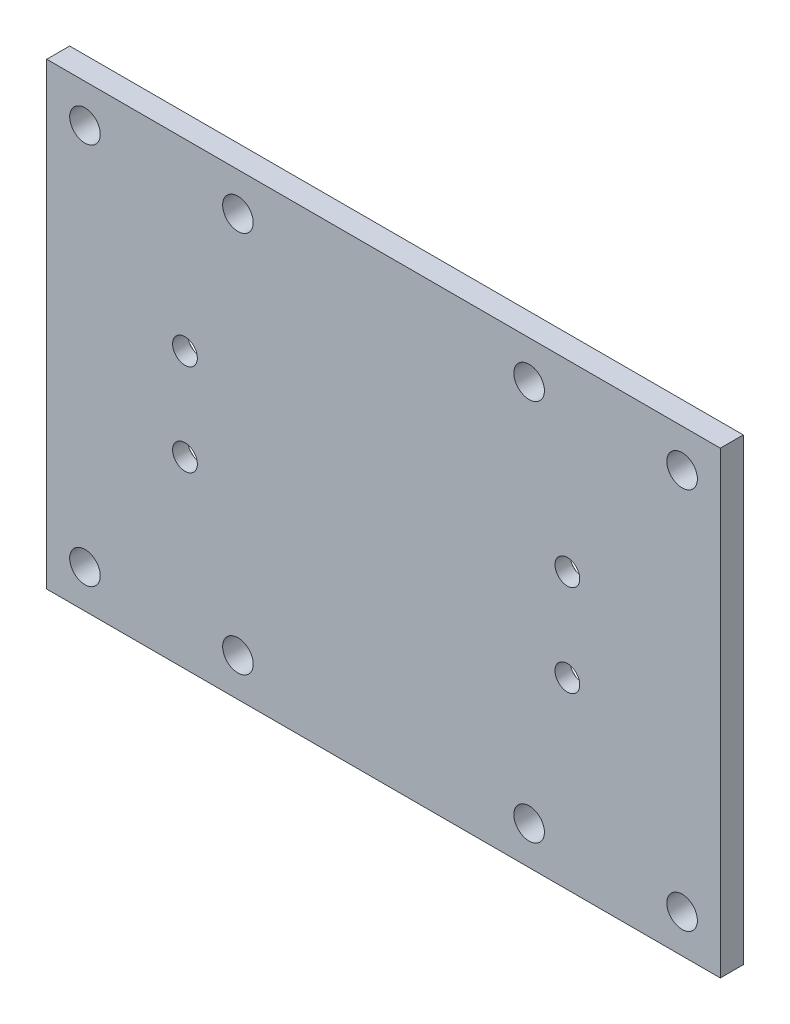
ISO-10303-21;
HEADER;
FILE_DESCRIPTION(('STEP AP214'),'2;1');
FILE_NAME('part.step','',(''),(''),'','','');
FILE_SCHEMA(('AUTOMOTIVE_DESIGN { 1 0 10303 214 1 1 1 1 }'));
ENDSEC;
DATA;
#1=APPLICATION_CONTEXT('core data for automotive mechanical design processes');
#2=APPLICATION_PROTOCOL_DEFINITION('international standard','automotive_design',2000,#1);
#3=PRODUCT_CONTEXT('',#1,'mechanical');
#4=PRODUCT('Part','Part','',(#3));
#5=PRODUCT_RELATED_PRODUCT_CATEGORY('part','',(#4));
#6=PRODUCT_DEFINITION_FORMATION('','',#4);
#7=PRODUCT_DEFINITION_CONTEXT('part definition',#1,'design');
#8=PRODUCT_DEFINITION('design','',#6,#7);
#9=PRODUCT_DEFINITION_SHAPE('','',#8);
#10=(LENGTH_UNIT() NAMED_UNIT(*) SI_UNIT(.MILLI.,.METRE.));
#11=(NAMED_UNIT(*) PLANE_ANGLE_UNIT() SI_UNIT($,.RADIAN.));
#12=(NAMED_UNIT(*) SI_UNIT($,.STERADIAN.) SOLID_ANGLE_UNIT());
#13=UNCERTAINTY_MEASURE_WITH_UNIT(LENGTH_MEASURE(1.E-05),#10,'distance_accuracy_value','');
#14=(GEOMETRIC_REPRESENTATION_CONTEXT(3) GLOBAL_UNCERTAINTY_ASSIGNED_CONTEXT((#13)) GLOBAL_UNIT_ASSIGNED_CONTEXT((#10,
#11,#12)) REPRESENTATION_CONTEXT('',''));
#15=CARTESIAN_POINT('',(0.,0.,0.));
#16=DIRECTION('',(0.,0.,1.));
#17=DIRECTION('',(1.,0.,0.));
#18=AXIS2_PLACEMENT_3D('',#15,#16,#17);
#19=CARTESIAN_POINT('',(-96.4046078557331,36.,3.));
#20=DIRECTION('',(0.,0.,-1.));
#21=DIRECTION('',(-1.,0.,0.));
#22=AXIS2_PLACEMENT_3D('',#19,#20,#21);
#23=CYLINDRICAL_SURFACE('',#22,1.62);
#24=CARTESIAN_POINT('',(-96.4046078557331,36.,3.));
#25=DIRECTION('',(0.,0.,-1.));
#26=DIRECTION('',(-1.,0.,0.));
#27=AXIS2_PLACEMENT_3D('',#24,#25,#26);
#28=CIRCLE('',#27,1.62);
#29=CARTESIAN_POINT('',(-98.0246078557331,36.,3.));
#30=VERTEX_POINT('',#29);
#31=EDGE_CURVE('E142',#30,#30,#28,.T.);
#32=ORIENTED_EDGE('',*,*,#31,.F.);
#33=EDGE_LOOP('',(#32));
#34=FACE_BOUND('',#33,.T.);
#35=CARTESIAN_POINT('',(-96.4046078557331,36.,1.));
#36=DIRECTION('',(0.,0.,-1.));
#37=DIRECTION('',(-1.,0.,0.));
#38=AXIS2_PLACEMENT_3D('',#35,#36,#37);
#39=CIRCLE('',#38,1.62);
#40=CARTESIAN_POINT('',(-98.0246078557331,36.,1.));
#41=VERTEX_POINT('',#40);
#42=EDGE_CURVE('E43',#41,#41,#39,.F.);
#43=ORIENTED_EDGE('',*,*,#42,.F.);
#44=EDGE_LOOP('',(#43));
#45=FACE_BOUND('',#44,.T.);
#46=ADVANCED_FACE('F39',(#34,#45),#23,.F.);
#47=CARTESIAN_POINT('',(-146.404607855733,24.,3.));
#48=DIRECTION('',(0.,0.,-1.));
#49=DIRECTION('',(-1.,0.,0.));
#50=AXIS2_PLACEMENT_3D('',#47,#48,#49);
#51=CYLINDRICAL_SURFACE('',#50,1.62000000000001);
#52=CARTESIAN_POINT('',(-146.404607855733,24.,3.));
#53=DIRECTION('',(0.,0.,-1.));
#54=DIRECTION('',(-1.,0.,0.));
#55=AXIS2_PLACEMENT_3D('',#52,#53,#54);
#56=CIRCLE('',#55,1.62000000000001);
#57=CARTESIAN_POINT('',(-148.024607855733,24.,3.));
#58=VERTEX_POINT('',#57);
#59=EDGE_CURVE('E126',#58,#58,#56,.T.);
#60=ORIENTED_EDGE('',*,*,#59,.F.);
#61=EDGE_LOOP('',(#60));
#62=FACE_BOUND('',#61,.T.);
#63=CARTESIAN_POINT('',(-146.404607855733,24.,1.));
#64=DIRECTION('',(0.,0.,-1.));
#65=DIRECTION('',(-1.,0.,0.));
#66=AXIS2_PLACEMENT_3D('',#63,#64,#65);
#67=CIRCLE('',#66,1.62000000000001);
#68=CARTESIAN_POINT('',(-148.024607855733,24.,1.));
#69=VERTEX_POINT('',#68);
#70=EDGE_CURVE('E121',#69,#69,#67,.F.);
#71=ORIENTED_EDGE('',*,*,#70,.F.);
#72=EDGE_LOOP('',(#71));
#73=FACE_BOUND('',#72,.T.);
#74=ADVANCED_FACE('F212',(#62,#73),#51,.F.);
#75=CARTESIAN_POINT('',(-146.404607855733,36.,3.));
#76=DIRECTION('',(0.,0.,-1.));
#77=DIRECTION('',(-1.,0.,0.));
#78=AXIS2_PLACEMENT_3D('',#75,#76,#77);
#79=CYLINDRICAL_SURFACE('',#78,1.62000000000001);
#80=CARTESIAN_POINT('',(-146.404607855733,36.,3.));
#81=DIRECTION('',(0.,0.,-1.));
#82=DIRECTION('',(-1.,0.,0.));
#83=AXIS2_PLACEMENT_3D('',#80,#81,#82);
#84=CIRCLE('',#83,1.62000000000001);
#85=CARTESIAN_POINT('',(-148.024607855733,36.,3.));
#86=VERTEX_POINT('',#85);
#87=EDGE_CURVE('E130',#86,#86,#84,.T.);
#88=ORIENTED_EDGE('',*,*,#87,.F.);
#89=EDGE_LOOP('',(#88));
#90=FACE_BOUND('',#89,.T.);
#91=CARTESIAN_POINT('',(-146.404607855733,36.,1.));
#92=DIRECTION('',(0.,0.,-1.));
#93=DIRECTION('',(-1.,0.,0.));
#94=AXIS2_PLACEMENT_3D('',#91,#92,#93);
#95=CIRCLE('',#94,1.62000000000001);
#96=CARTESIAN_POINT('',(-148.024607855733,36.,1.));
#97=VERTEX_POINT('',#96);
#98=EDGE_CURVE('E118',#97,#97,#95,.F.);
#99=ORIENTED_EDGE('',*,*,#98,.F.);
#100=EDGE_LOOP('',(#99));
#101=FACE_BOUND('',#100,.T.);
#102=ADVANCED_FACE('F218',(#90,#101),#79,.F.);
#103=CARTESIAN_POINT('',(-96.4046078557331,24.,3.));
#104=DIRECTION('',(0.,0.,-1.));
#105=DIRECTION('',(-1.,0.,0.));
#106=AXIS2_PLACEMENT_3D('',#103,#104,#105);
#107=CYLINDRICAL_SURFACE('',#106,1.62);
#108=CARTESIAN_POINT('',(-96.4046078557331,24.,3.));
#109=DIRECTION('',(0.,0.,-1.));
#110=DIRECTION('',(-1.,0.,0.));
#111=AXIS2_PLACEMENT_3D('',#108,#109,#110);
#112=CIRCLE('',#111,1.62);
#113=CARTESIAN_POINT('',(-98.0246078557331,24.,3.));
#114=VERTEX_POINT('',#113);
#115=EDGE_CURVE('E135',#114,#114,#112,.T.);
#116=ORIENTED_EDGE('',*,*,#115,.F.);
#117=EDGE_LOOP('',(#116));
#118=FACE_BOUND('',#117,.T.);
#119=CARTESIAN_POINT('',(-96.4046078557331,24.,1.));
#120=DIRECTION('',(0.,0.,-1.));
#121=DIRECTION('',(-1.,0.,0.));
#122=AXIS2_PLACEMENT_3D('',#119,#120,#121);
#123=CIRCLE('',#122,1.62);
#124=CARTESIAN_POINT('',(-98.0246078557331,24.,1.));
#125=VERTEX_POINT('',#124);
#126=EDGE_CURVE('E115',#125,#125,#123,.F.);
#127=ORIENTED_EDGE('',*,*,#126,.F.);
#128=EDGE_LOOP('',(#127));
#129=FACE_BOUND('',#128,.T.);
#130=ADVANCED_FACE('F263',(#118,#129),#107,.F.);
#131=CARTESIAN_POINT('',(-164.481054365733,60.,3.));
#132=DIRECTION('',(1.,0.,0.));
#133=DIRECTION('',(0.,0.,-1.));
#134=AXIS2_PLACEMENT_3D('',#131,#132,#133);
#135=PLANE('',#134);
#136=DIRECTION('',(0.,-1.,0.));
#137=VECTOR('',#136,1.);
#138=CARTESIAN_POINT('',(-164.481054365733,60.,0.));
#139=LINE('',#138,#137);
#140=CARTESIAN_POINT('',(-164.481054365733,60.,0.));
#141=VERTEX_POINT('',#140);
#142=CARTESIAN_POINT('',(-164.481054365733,0.,0.));
#143=VERTEX_POINT('',#142);
#144=EDGE_CURVE('E106',#141,#143,#139,.T.);
#145=ORIENTED_EDGE('',*,*,#144,.T.);
#146=DIRECTION('',(0.,0.,-1.));
#147=VECTOR('',#146,1.);
#148=CARTESIAN_POINT('',(-164.481054365733,0.,3.));
#149=LINE('',#148,#147);
#150=CARTESIAN_POINT('',(-164.481054365733,0.,3.));
#151=VERTEX_POINT('',#150);
#152=EDGE_CURVE('E11',#151,#143,#149,.T.);
#153=ORIENTED_EDGE('',*,*,#152,.F.);
#154=DIRECTION('',(0.,-1.,0.));
#155=VECTOR('',#154,1.);
#156=CARTESIAN_POINT('',(-164.481054365733,60.,3.));
#157=LINE('',#156,#155);
#158=CARTESIAN_POINT('',(-164.481054365733,60.,3.));
#159=VERTEX_POINT('',#158);
#160=EDGE_CURVE('E93',#159,#151,#157,.T.);
#161=ORIENTED_EDGE('',*,*,#160,.F.);
#162=DIRECTION('',(0.,0.,-1.));
#163=VECTOR('',#162,1.);
#164=CARTESIAN_POINT('',(-164.481054365733,60.,3.));
#165=LINE('',#164,#163);
#166=EDGE_CURVE('E102',#159,#141,#165,.T.);
#167=ORIENTED_EDGE('',*,*,#166,.T.);
#168=EDGE_LOOP('',(#145,#153,#161,#167));
#169=FACE_BOUND('',#168,.T.);
#170=ADVANCED_FACE('F41',(#169),#135,.F.);
#171=CARTESIAN_POINT('',(-164.481054365733,0.,3.));
#172=DIRECTION('',(0.,1.,0.));
#173=DIRECTION('',(0.,0.,1.));
#174=AXIS2_PLACEMENT_3D('',#171,#172,#173);
#175=PLANE('',#174);
#176=DIRECTION('',(1.,0.,0.));
#177=VECTOR('',#176,1.);
#178=CARTESIAN_POINT('',(-164.481054365733,0.,0.));
#179=LINE('',#178,#177);
#180=CARTESIAN_POINT('',(-76.4046078557331,0.,0.));
#181=VERTEX_POINT('',#180);
#182=EDGE_CURVE('E97',#143,#181,#179,.T.);
#183=ORIENTED_EDGE('',*,*,#182,.T.);
#184=DIRECTION('',(0.,0.,-1.));
#185=VECTOR('',#184,1.);
#186=CARTESIAN_POINT('',(-76.4046078557331,0.,3.));
#187=LINE('',#186,#185);
#188=CARTESIAN_POINT('',(-76.4046078557331,0.,3.));
#189=VERTEX_POINT('',#188);
#190=EDGE_CURVE('E49',#189,#181,#187,.T.);
#191=ORIENTED_EDGE('',*,*,#190,.F.);
#192=DIRECTION('',(1.,0.,0.));
#193=VECTOR('',#192,1.);
#194=CARTESIAN_POINT('',(-164.481054365733,0.,3.));
#195=LINE('',#194,#193);
#196=EDGE_CURVE('E88',#151,#189,#195,.T.);
#197=ORIENTED_EDGE('',*,*,#196,.F.);
#198=ORIENTED_EDGE('',*,*,#152,.T.);
#199=EDGE_LOOP('',(#183,#191,#197,#198));
#200=FACE_BOUND('',#199,.T.);
#201=ADVANCED_FACE('F96',(#200),#175,.F.);
#202=CARTESIAN_POINT('',(-76.4046078557331,60.,3.));
#203=DIRECTION('',(-1.,0.,0.));
#204=DIRECTION('',(0.,-1.,0.));
#205=AXIS2_PLACEMENT_3D('',#202,#203,#204);
#206=PLANE('',#205);
#207=DIRECTION('',(0.,1.,0.));
#208=VECTOR('',#207,1.);
#209=CARTESIAN_POINT('',(-76.4046078557331,60.,0.));
#210=LINE('',#209,#208);
#211=CARTESIAN_POINT('',(-76.4046078557331,60.,0.));
#212=VERTEX_POINT('',#211);
#213=EDGE_CURVE('E75',#181,#212,#210,.T.);
#214=ORIENTED_EDGE('',*,*,#213,.T.);
#215=DIRECTION('',(0.,0.,-1.));
#216=VECTOR('',#215,1.);
#217=CARTESIAN_POINT('',(-76.4046078557331,60.,3.));
#218=LINE('',#217,#216);
#219=CARTESIAN_POINT('',(-76.4046078557331,60.,3.));
#220=VERTEX_POINT('',#219);
#221=EDGE_CURVE('E98',#220,#212,#218,.T.);
#222=ORIENTED_EDGE('',*,*,#221,.F.);
#223=DIRECTION('',(0.,1.,0.));
#224=VECTOR('',#223,1.);
#225=CARTESIAN_POINT('',(-76.4046078557331,60.,3.));
#226=LINE('',#225,#224);
#227=EDGE_CURVE('E91',#189,#220,#226,.T.);
#228=ORIENTED_EDGE('',*,*,#227,.F.);
#229=ORIENTED_EDGE('',*,*,#190,.T.);
#230=EDGE_LOOP('',(#214,#222,#228,#229));
#231=FACE_BOUND('',#230,.T.);
#232=ADVANCED_FACE('F100',(#231),#206,.F.);
#233=CARTESIAN_POINT('',(-164.481054365733,60.,3.));
#234=DIRECTION('',(0.,-1.,0.));
#235=DIRECTION('',(0.,0.,-1.));
#236=AXIS2_PLACEMENT_3D('',#233,#234,#235);
#237=PLANE('',#236);
#238=DIRECTION('',(-1.,0.,0.));
#239=VECTOR('',#238,1.);
#240=CARTESIAN_POINT('',(-164.481054365733,60.,0.));
#241=LINE('',#240,#239);
#242=EDGE_CURVE('E81',#212,#141,#241,.T.);
#243=ORIENTED_EDGE('',*,*,#242,.T.);
#244=ORIENTED_EDGE('',*,*,#166,.F.);
#245=DIRECTION('',(-1.,0.,0.));
#246=VECTOR('',#245,1.);
#247=CARTESIAN_POINT('',(-164.481054365733,60.,3.));
#248=LINE('',#247,#246);
#249=EDGE_CURVE('E58',#220,#159,#248,.T.);
#250=ORIENTED_EDGE('',*,*,#249,.F.);
#251=ORIENTED_EDGE('',*,*,#221,.T.);
#252=EDGE_LOOP('',(#243,#244,#250,#251));
#253=FACE_BOUND('',#252,.T.);
#254=ADVANCED_FACE('F198',(#253),#237,.F.);
#255=CARTESIAN_POINT('',(0.,0.,3.));
#256=DIRECTION('',(0.,0.,1.));
#257=DIRECTION('',(1.,0.,0.));
#258=AXIS2_PLACEMENT_3D('',#255,#256,#257);
#259=PLANE('',#258);
#260=ORIENTED_EDGE('',*,*,#115,.T.);
#261=EDGE_LOOP('',(#260));
#262=FACE_BOUND('',#261,.T.);
#263=ORIENTED_EDGE('',*,*,#87,.T.);
#264=EDGE_LOOP('',(#263));
#265=FACE_BOUND('',#264,.T.);
#266=ORIENTED_EDGE('',*,*,#59,.T.);
#267=EDGE_LOOP('',(#266));
#268=FACE_BOUND('',#267,.T.);
#269=ORIENTED_EDGE('',*,*,#31,.T.);
#270=EDGE_LOOP('',(#269));
#271=FACE_BOUND('',#270,.T.);
#272=CARTESIAN_POINT('',(-81.4046078557331,5.,3.));
#273=DIRECTION('',(0.,0.,1.));
#274=DIRECTION('',(1.,0.,0.));
#275=AXIS2_PLACEMENT_3D('',#272,#273,#274);
#276=CIRCLE('',#275,2.);
#277=CARTESIAN_POINT('',(-79.4046078557331,5.,3.));
#278=VERTEX_POINT('',#277);
#279=EDGE_CURVE('E172',#278,#278,#276,.T.);
#280=ORIENTED_EDGE('',*,*,#279,.F.);
#281=EDGE_LOOP('',(#280));
#282=FACE_BOUND('',#281,.T.);
#283=CARTESIAN_POINT('',(-139.481054365733,55.,3.));
#284=DIRECTION('',(0.,0.,1.));
#285=DIRECTION('',(1.,0.,0.));
#286=AXIS2_PLACEMENT_3D('',#283,#284,#285);
#287=CIRCLE('',#286,2.);
#288=CARTESIAN_POINT('',(-137.481054365733,55.,3.));
#289=VERTEX_POINT('',#288);
#290=EDGE_CURVE('E165',#289,#289,#287,.T.);
#291=ORIENTED_EDGE('',*,*,#290,.F.);
#292=EDGE_LOOP('',(#291));
#293=FACE_BOUND('',#292,.T.);
#294=CARTESIAN_POINT('',(-139.481054365733,5.,3.));
#295=DIRECTION('',(0.,0.,1.));
#296=DIRECTION('',(1.,0.,0.));
#297=AXIS2_PLACEMENT_3D('',#294,#295,#296);
#298=CIRCLE('',#297,2.);
#299=CARTESIAN_POINT('',(-137.481054365733,5.,3.));
#300=VERTEX_POINT('',#299);
#301=EDGE_CURVE('E184',#300,#300,#298,.T.);
#302=ORIENTED_EDGE('',*,*,#301,.F.);
#303=EDGE_LOOP('',(#302));
#304=FACE_BOUND('',#303,.T.);
#305=CARTESIAN_POINT('',(-159.481054365733,55.,3.));
#306=DIRECTION('',(0.,0.,1.));
#307=DIRECTION('',(1.,0.,0.));
#308=AXIS2_PLACEMENT_3D('',#305,#306,#307);
#309=CIRCLE('',#308,2.);
#310=CARTESIAN_POINT('',(-157.481054365733,55.,3.));
#311=VERTEX_POINT('',#310);
#312=EDGE_CURVE('E177',#311,#311,#309,.T.);
#313=ORIENTED_EDGE('',*,*,#312,.F.);
#314=EDGE_LOOP('',(#313));
#315=FACE_BOUND('',#314,.T.);
#316=CARTESIAN_POINT('',(-81.4046078557331,55.,3.));
#317=DIRECTION('',(0.,0.,1.));
#318=DIRECTION('',(1.,0.,0.));
#319=AXIS2_PLACEMENT_3D('',#316,#317,#318);
#320=CIRCLE('',#319,2.);
#321=CARTESIAN_POINT('',(-79.4046078557331,55.,3.));
#322=VERTEX_POINT('',#321);
#323=EDGE_CURVE('E147',#322,#322,#320,.T.);
#324=ORIENTED_EDGE('',*,*,#323,.F.);
#325=EDGE_LOOP('',(#324));
#326=FACE_BOUND('',#325,.T.);
#327=CARTESIAN_POINT('',(-101.404607855733,55.,3.));
#328=DIRECTION('',(0.,0.,1.));
#329=DIRECTION('',(1.,0.,0.));
#330=AXIS2_PLACEMENT_3D('',#327,#328,#329);
#331=CIRCLE('',#330,2.);
#332=CARTESIAN_POINT('',(-99.4046078557331,55.,3.));
#333=VERTEX_POINT('',#332);
#334=EDGE_CURVE('E154',#333,#333,#331,.T.);
#335=ORIENTED_EDGE('',*,*,#334,.F.);
#336=EDGE_LOOP('',(#335));
#337=FACE_BOUND('',#336,.T.);
#338=CARTESIAN_POINT('',(-101.404607855733,5.,3.));
#339=DIRECTION('',(0.,0.,1.));
#340=DIRECTION('',(1.,0.,0.));
#341=AXIS2_PLACEMENT_3D('',#338,#339,#340);
#342=CIRCLE('',#341,2.);
#343=CARTESIAN_POINT('',(-99.4046078557331,5.,3.));
#344=VERTEX_POINT('',#343);
#345=EDGE_CURVE('E160',#344,#344,#342,.T.);
#346=ORIENTED_EDGE('',*,*,#345,.F.);
#347=EDGE_LOOP('',(#346));
#348=FACE_BOUND('',#347,.T.);
#349=CARTESIAN_POINT('',(-159.481054365733,5.,3.));
#350=DIRECTION('',(0.,0.,1.));
#351=DIRECTION('',(1.,0.,0.));
#352=AXIS2_PLACEMENT_3D('',#349,#350,#351);
#353=CIRCLE('',#352,2.);
#354=CARTESIAN_POINT('',(-157.481054365733,5.,3.));
#355=VERTEX_POINT('',#354);
#356=EDGE_CURVE('E180',#355,#355,#353,.T.);
#357=ORIENTED_EDGE('',*,*,#356,.F.);
#358=EDGE_LOOP('',(#357));
#359=FACE_BOUND('',#358,.T.);
#360=ORIENTED_EDGE('',*,*,#160,.T.);
#361=ORIENTED_EDGE('',*,*,#196,.T.);
#362=ORIENTED_EDGE('',*,*,#227,.T.);
#363=ORIENTED_EDGE('',*,*,#249,.T.);
#364=EDGE_LOOP('',(#360,#361,#362,#363));
#365=FACE_BOUND('',#364,.T.);
#366=ADVANCED_FACE('F89',(#262,#265,#268,#271,#282,#293,#304,#315,#326,#337,#348,#359,#365),
#259,.T.);
#367=CARTESIAN_POINT('',(0.,0.,0.));
#368=DIRECTION('',(0.,0.,1.));
#369=DIRECTION('',(1.,0.,0.));
#370=AXIS2_PLACEMENT_3D('',#367,#368,#369);
#371=PLANE('',#370);
#372=CARTESIAN_POINT('',(-96.4046078557331,24.,0.));
#373=DIRECTION('',(0.,0.,-1.));
#374=DIRECTION('',(-1.,0.,0.));
#375=AXIS2_PLACEMENT_3D('',#372,#373,#374);
#376=CIRCLE('',#375,3.00000000000001);
#377=CARTESIAN_POINT('',(-99.4046078557331,24.,0.));
#378=VERTEX_POINT('',#377);
#379=EDGE_CURVE('E323',#378,#378,#376,.T.);
#380=ORIENTED_EDGE('',*,*,#379,.F.);
#381=EDGE_LOOP('',(#380));
#382=FACE_BOUND('',#381,.T.);
#383=CARTESIAN_POINT('',(-146.404607855733,36.,0.));
#384=DIRECTION('',(0.,0.,-1.));
#385=DIRECTION('',(-1.,0.,0.));
#386=AXIS2_PLACEMENT_3D('',#383,#384,#385);
#387=CIRCLE('',#386,2.99999999999999);
#388=CARTESIAN_POINT('',(-149.404607855733,36.,0.));
#389=VERTEX_POINT('',#388);
#390=EDGE_CURVE('E319',#389,#389,#387,.T.);
#391=ORIENTED_EDGE('',*,*,#390,.F.);
#392=EDGE_LOOP('',(#391));
#393=FACE_BOUND('',#392,.T.);
#394=CARTESIAN_POINT('',(-146.404607855733,24.,0.));
#395=DIRECTION('',(0.,0.,-1.));
#396=DIRECTION('',(-1.,0.,0.));
#397=AXIS2_PLACEMENT_3D('',#394,#395,#396);
#398=CIRCLE('',#397,2.99999999999999);
#399=CARTESIAN_POINT('',(-149.404607855733,24.,0.));
#400=VERTEX_POINT('',#399);
#401=EDGE_CURVE('E314',#400,#400,#398,.T.);
#402=ORIENTED_EDGE('',*,*,#401,.F.);
#403=EDGE_LOOP('',(#402));
#404=FACE_BOUND('',#403,.T.);
#405=CARTESIAN_POINT('',(-96.4046078557331,36.,0.));
#406=DIRECTION('',(0.,0.,-1.));
#407=DIRECTION('',(-1.,0.,0.));
#408=AXIS2_PLACEMENT_3D('',#405,#406,#407);
#409=CIRCLE('',#408,3.00000000000001);
#410=CARTESIAN_POINT('',(-99.4046078557331,36.,0.));
#411=VERTEX_POINT('',#410);
#412=EDGE_CURVE('E139',#411,#411,#409,.T.);
#413=ORIENTED_EDGE('',*,*,#412,.F.);
#414=EDGE_LOOP('',(#413));
#415=FACE_BOUND('',#414,.T.);
#416=CARTESIAN_POINT('',(-81.4046078557331,5.,0.));
#417=DIRECTION('',(0.,0.,1.));
#418=DIRECTION('',(1.,0.,0.));
#419=AXIS2_PLACEMENT_3D('',#416,#417,#418);
#420=CIRCLE('',#419,2.);
#421=CARTESIAN_POINT('',(-79.4046078557331,5.,0.));
#422=VERTEX_POINT('',#421);
#423=EDGE_CURVE('E150',#422,#422,#420,.T.);
#424=ORIENTED_EDGE('',*,*,#423,.T.);
#425=EDGE_LOOP('',(#424));
#426=FACE_BOUND('',#425,.T.);
#427=CARTESIAN_POINT('',(-139.481054365733,55.,0.));
#428=DIRECTION('',(0.,0.,1.));
#429=DIRECTION('',(1.,0.,0.));
#430=AXIS2_PLACEMENT_3D('',#427,#428,#429);
#431=CIRCLE('',#430,2.);
#432=CARTESIAN_POINT('',(-137.481054365733,55.,0.));
#433=VERTEX_POINT('',#432);
#434=EDGE_CURVE('E169',#433,#433,#431,.T.);
#435=ORIENTED_EDGE('',*,*,#434,.T.);
#436=EDGE_LOOP('',(#435));
#437=FACE_BOUND('',#436,.T.);
#438=CARTESIAN_POINT('',(-139.481054365733,5.,0.));
#439=DIRECTION('',(0.,0.,1.));
#440=DIRECTION('',(1.,0.,0.));
#441=AXIS2_PLACEMENT_3D('',#438,#439,#440);
#442=CIRCLE('',#441,2.);
#443=CARTESIAN_POINT('',(-137.481054365733,5.,0.));
#444=VERTEX_POINT('',#443);
#445=EDGE_CURVE('E168',#444,#444,#442,.T.);
#446=ORIENTED_EDGE('',*,*,#445,.T.);
#447=EDGE_LOOP('',(#446));
#448=FACE_BOUND('',#447,.T.);
#449=CARTESIAN_POINT('',(-159.481054365733,55.,0.));
#450=DIRECTION('',(0.,0.,1.));
#451=DIRECTION('',(1.,0.,0.));
#452=AXIS2_PLACEMENT_3D('',#449,#450,#451);
#453=CIRCLE('',#452,2.);
#454=CARTESIAN_POINT('',(-157.481054365733,55.,0.));
#455=VERTEX_POINT('',#454);
#456=EDGE_CURVE('E181',#455,#455,#453,.T.);
#457=ORIENTED_EDGE('',*,*,#456,.T.);
#458=EDGE_LOOP('',(#457));
#459=FACE_BOUND('',#458,.T.);
#460=CARTESIAN_POINT('',(-81.4046078557331,55.,0.));
#461=DIRECTION('',(0.,0.,1.));
#462=DIRECTION('',(1.,0.,0.));
#463=AXIS2_PLACEMENT_3D('',#460,#461,#462);
#464=CIRCLE('',#463,2.);
#465=CARTESIAN_POINT('',(-79.4046078557331,55.,0.));
#466=VERTEX_POINT('',#465);
#467=EDGE_CURVE('E151',#466,#466,#464,.T.);
#468=ORIENTED_EDGE('',*,*,#467,.T.);
#469=EDGE_LOOP('',(#468));
#470=FACE_BOUND('',#469,.T.);
#471=CARTESIAN_POINT('',(-101.404607855733,55.,0.));
#472=DIRECTION('',(0.,0.,1.));
#473=DIRECTION('',(1.,0.,0.));
#474=AXIS2_PLACEMENT_3D('',#471,#472,#473);
#475=CIRCLE('',#474,2.);
#476=CARTESIAN_POINT('',(-99.4046078557331,55.,0.));
#477=VERTEX_POINT('',#476);
#478=EDGE_CURVE('E157',#477,#477,#475,.T.);
#479=ORIENTED_EDGE('',*,*,#478,.T.);
#480=EDGE_LOOP('',(#479));
#481=FACE_BOUND('',#480,.T.);
#482=CARTESIAN_POINT('',(-101.404607855733,5.,0.));
#483=DIRECTION('',(0.,0.,1.));
#484=DIRECTION('',(1.,0.,0.));
#485=AXIS2_PLACEMENT_3D('',#482,#483,#484);
#486=CIRCLE('',#485,2.);
#487=CARTESIAN_POINT('',(-99.4046078557331,5.,0.));
#488=VERTEX_POINT('',#487);
#489=EDGE_CURVE('E146',#488,#488,#486,.T.);
#490=ORIENTED_EDGE('',*,*,#489,.T.);
#491=EDGE_LOOP('',(#490));
#492=FACE_BOUND('',#491,.T.);
#493=CARTESIAN_POINT('',(-159.481054365733,5.,0.));
#494=DIRECTION('',(0.,0.,1.));
#495=DIRECTION('',(1.,0.,0.));
#496=AXIS2_PLACEMENT_3D('',#493,#494,#495);
#497=CIRCLE('',#496,2.);
#498=CARTESIAN_POINT('',(-157.481054365733,5.,0.));
#499=VERTEX_POINT('',#498);
#500=EDGE_CURVE('E109',#499,#499,#497,.T.);
#501=ORIENTED_EDGE('',*,*,#500,.T.);
#502=EDGE_LOOP('',(#501));
#503=FACE_BOUND('',#502,.T.);
#504=ORIENTED_EDGE('',*,*,#144,.F.);
#505=ORIENTED_EDGE('',*,*,#242,.F.);
#506=ORIENTED_EDGE('',*,*,#213,.F.);
#507=ORIENTED_EDGE('',*,*,#182,.F.);
#508=EDGE_LOOP('',(#504,#505,#506,#507));
#509=FACE_BOUND('',#508,.T.);
#510=ADVANCED_FACE('F197',(#382,#393,#404,#415,#426,#437,#448,#459,#470,#481,#492,#503,#509),
#371,.F.);
#511=CARTESIAN_POINT('',(-159.481054365733,5.,0.));
#512=DIRECTION('',(0.,0.,1.));
#513=DIRECTION('',(1.,0.,0.));
#514=AXIS2_PLACEMENT_3D('',#511,#512,#513);
#515=CYLINDRICAL_SURFACE('',#514,2.);
#516=ORIENTED_EDGE('',*,*,#500,.F.);
#517=EDGE_LOOP('',(#516));
#518=FACE_BOUND('',#517,.T.);
#519=ORIENTED_EDGE('',*,*,#356,.T.);
#520=EDGE_LOOP('',(#519));
#521=FACE_BOUND('',#520,.T.);
#522=ADVANCED_FACE('F194',(#518,#521),#515,.F.);
#523=CARTESIAN_POINT('',(-101.404607855733,5.,0.));
#524=DIRECTION('',(0.,0.,1.));
#525=DIRECTION('',(1.,0.,0.));
#526=AXIS2_PLACEMENT_3D('',#523,#524,#525);
#527=CYLINDRICAL_SURFACE('',#526,2.);
#528=ORIENTED_EDGE('',*,*,#489,.F.);
#529=EDGE_LOOP('',(#528));
#530=FACE_BOUND('',#529,.T.);
#531=ORIENTED_EDGE('',*,*,#345,.T.);
#532=EDGE_LOOP('',(#531));
#533=FACE_BOUND('',#532,.T.);
#534=ADVANCED_FACE('F234',(#530,#533),#527,.F.);
#535=CARTESIAN_POINT('',(-101.404607855733,55.,0.));
#536=DIRECTION('',(0.,0.,1.));
#537=DIRECTION('',(1.,0.,0.));
#538=AXIS2_PLACEMENT_3D('',#535,#536,#537);
#539=CYLINDRICAL_SURFACE('',#538,2.);
#540=ORIENTED_EDGE('',*,*,#478,.F.);
#541=EDGE_LOOP('',(#540));
#542=FACE_BOUND('',#541,.T.);
#543=ORIENTED_EDGE('',*,*,#334,.T.);
#544=EDGE_LOOP('',(#543));
#545=FACE_BOUND('',#544,.T.);
#546=ADVANCED_FACE('F230',(#542,#545),#539,.F.);
#547=CARTESIAN_POINT('',(-81.4046078557331,55.,0.));
#548=DIRECTION('',(0.,0.,1.));
#549=DIRECTION('',(1.,0.,0.));
#550=AXIS2_PLACEMENT_3D('',#547,#548,#549);
#551=CYLINDRICAL_SURFACE('',#550,2.);
#552=ORIENTED_EDGE('',*,*,#467,.F.);
#553=EDGE_LOOP('',(#552));
#554=FACE_BOUND('',#553,.T.);
#555=ORIENTED_EDGE('',*,*,#323,.T.);
#556=EDGE_LOOP('',(#555));
#557=FACE_BOUND('',#556,.T.);
#558=ADVANCED_FACE('F226',(#554,#557),#551,.F.);
#559=CARTESIAN_POINT('',(-159.481054365733,55.,0.));
#560=DIRECTION('',(0.,0.,1.));
#561=DIRECTION('',(1.,0.,0.));
#562=AXIS2_PLACEMENT_3D('',#559,#560,#561);
#563=CYLINDRICAL_SURFACE('',#562,2.);
#564=ORIENTED_EDGE('',*,*,#456,.F.);
#565=EDGE_LOOP('',(#564));
#566=FACE_BOUND('',#565,.T.);
#567=ORIENTED_EDGE('',*,*,#312,.T.);
#568=EDGE_LOOP('',(#567));
#569=FACE_BOUND('',#568,.T.);
#570=ADVANCED_FACE('F229',(#566,#569),#563,.F.);
#571=CARTESIAN_POINT('',(-139.481054365733,5.,0.));
#572=DIRECTION('',(0.,0.,1.));
#573=DIRECTION('',(1.,0.,0.));
#574=AXIS2_PLACEMENT_3D('',#571,#572,#573);
#575=CYLINDRICAL_SURFACE('',#574,2.);
#576=ORIENTED_EDGE('',*,*,#445,.F.);
#577=EDGE_LOOP('',(#576));
#578=FACE_BOUND('',#577,.T.);
#579=ORIENTED_EDGE('',*,*,#301,.T.);
#580=EDGE_LOOP('',(#579));
#581=FACE_BOUND('',#580,.T.);
#582=ADVANCED_FACE('F243',(#578,#581),#575,.F.);
#583=CARTESIAN_POINT('',(-139.481054365733,55.,0.));
#584=DIRECTION('',(0.,0.,1.));
#585=DIRECTION('',(1.,0.,0.));
#586=AXIS2_PLACEMENT_3D('',#583,#584,#585);
#587=CYLINDRICAL_SURFACE('',#586,2.);
#588=ORIENTED_EDGE('',*,*,#434,.F.);
#589=EDGE_LOOP('',(#588));
#590=FACE_BOUND('',#589,.T.);
#591=ORIENTED_EDGE('',*,*,#290,.T.);
#592=EDGE_LOOP('',(#591));
#593=FACE_BOUND('',#592,.T.);
#594=ADVANCED_FACE('F239',(#590,#593),#587,.F.);
#595=CARTESIAN_POINT('',(-81.4046078557331,5.,0.));
#596=DIRECTION('',(0.,0.,1.));
#597=DIRECTION('',(1.,0.,0.));
#598=AXIS2_PLACEMENT_3D('',#595,#596,#597);
#599=CYLINDRICAL_SURFACE('',#598,2.);
#600=ORIENTED_EDGE('',*,*,#423,.F.);
#601=EDGE_LOOP('',(#600));
#602=FACE_BOUND('',#601,.T.);
#603=ORIENTED_EDGE('',*,*,#279,.T.);
#604=EDGE_LOOP('',(#603));
#605=FACE_BOUND('',#604,.T.);
#606=ADVANCED_FACE('F242',(#602,#605),#599,.F.);
#607=CARTESIAN_POINT('',(-96.4046078557331,24.,1.));
#608=DIRECTION('',(0.,0.,-1.));
#609=DIRECTION('',(-1.,0.,0.));
#610=AXIS2_PLACEMENT_3D('',#607,#608,#609);
#611=PLANE('',#610);
#612=CARTESIAN_POINT('',(-96.4046078557331,24.,1.));
#613=DIRECTION('',(0.,0.,-1.));
#614=DIRECTION('',(-1.,0.,0.));
#615=AXIS2_PLACEMENT_3D('',#612,#613,#614);
#616=CIRCLE('',#615,3.00000000000001);
#617=CARTESIAN_POINT('',(-99.4046078557331,24.,1.));
#618=VERTEX_POINT('',#617);
#619=EDGE_CURVE('E326',#618,#618,#616,.T.);
#620=ORIENTED_EDGE('',*,*,#619,.T.);
#621=EDGE_LOOP('',(#620));
#622=FACE_BOUND('',#621,.T.);
#623=ORIENTED_EDGE('',*,*,#126,.T.);
#624=EDGE_LOOP('',(#623));
#625=FACE_BOUND('',#624,.T.);
#626=ADVANCED_FACE('F246',(#622,#625),#611,.T.);
#627=CARTESIAN_POINT('',(-96.4046078557331,24.,1.));
#628=DIRECTION('',(0.,0.,-1.));
#629=DIRECTION('',(-1.,0.,0.));
#630=AXIS2_PLACEMENT_3D('',#627,#628,#629);
#631=CYLINDRICAL_SURFACE('',#630,3.00000000000001);
#632=ORIENTED_EDGE('',*,*,#619,.F.);
#633=EDGE_LOOP('',(#632));
#634=FACE_BOUND('',#633,.T.);
#635=ORIENTED_EDGE('',*,*,#379,.T.);
#636=EDGE_LOOP('',(#635));
#637=FACE_BOUND('',#636,.T.);
#638=ADVANCED_FACE('F289',(#634,#637),#631,.F.);
#639=CARTESIAN_POINT('',(-146.404607855733,36.,1.));
#640=DIRECTION('',(0.,0.,-1.));
#641=DIRECTION('',(-1.,0.,0.));
#642=AXIS2_PLACEMENT_3D('',#639,#640,#641);
#643=PLANE('',#642);
#644=CARTESIAN_POINT('',(-146.404607855733,36.,1.));
#645=DIRECTION('',(0.,0.,-1.));
#646=DIRECTION('',(-1.,0.,0.));
#647=AXIS2_PLACEMENT_3D('',#644,#645,#646);
#648=CIRCLE('',#647,2.99999999999999);
#649=CARTESIAN_POINT('',(-149.404607855733,36.,1.));
#650=VERTEX_POINT('',#649);
#651=EDGE_CURVE('E316',#650,#650,#648,.T.);
#652=ORIENTED_EDGE('',*,*,#651,.T.);
#653=EDGE_LOOP('',(#652));
#654=FACE_BOUND('',#653,.T.);
#655=ORIENTED_EDGE('',*,*,#98,.T.);
#656=EDGE_LOOP('',(#655));
#657=FACE_BOUND('',#656,.T.);
#658=ADVANCED_FACE('F285',(#654,#657),#643,.T.);
#659=CARTESIAN_POINT('',(-146.404607855733,36.,1.));
#660=DIRECTION('',(0.,0.,-1.));
#661=DIRECTION('',(-1.,0.,0.));
#662=AXIS2_PLACEMENT_3D('',#659,#660,#661);
#663=CYLINDRICAL_SURFACE('',#662,2.99999999999999);
#664=ORIENTED_EDGE('',*,*,#651,.F.);
#665=EDGE_LOOP('',(#664));
#666=FACE_BOUND('',#665,.T.);
#667=ORIENTED_EDGE('',*,*,#390,.T.);
#668=EDGE_LOOP('',(#667));
#669=FACE_BOUND('',#668,.T.);
#670=ADVANCED_FACE('F288',(#666,#669),#663,.F.);
#671=CARTESIAN_POINT('',(-146.404607855733,24.,1.));
#672=DIRECTION('',(0.,0.,-1.));
#673=DIRECTION('',(-1.,0.,0.));
#674=AXIS2_PLACEMENT_3D('',#671,#672,#673);
#675=PLANE('',#674);
#676=CARTESIAN_POINT('',(-146.404607855733,24.,1.));
#677=DIRECTION('',(0.,0.,-1.));
#678=DIRECTION('',(-1.,0.,0.));
#679=AXIS2_PLACEMENT_3D('',#676,#677,#678);
#680=CIRCLE('',#679,2.99999999999999);
#681=CARTESIAN_POINT('',(-149.404607855733,24.,1.));
#682=VERTEX_POINT('',#681);
#683=EDGE_CURVE('E311',#682,#682,#680,.T.);
#684=ORIENTED_EDGE('',*,*,#683,.T.);
#685=EDGE_LOOP('',(#684));
#686=FACE_BOUND('',#685,.T.);
#687=ORIENTED_EDGE('',*,*,#70,.T.);
#688=EDGE_LOOP('',(#687));
#689=FACE_BOUND('',#688,.T.);
#690=ADVANCED_FACE('F293',(#686,#689),#675,.T.);
#691=CARTESIAN_POINT('',(-146.404607855733,24.,1.));
#692=DIRECTION('',(0.,0.,-1.));
#693=DIRECTION('',(-1.,0.,0.));
#694=AXIS2_PLACEMENT_3D('',#691,#692,#693);
#695=CYLINDRICAL_SURFACE('',#694,2.99999999999999);
#696=ORIENTED_EDGE('',*,*,#683,.F.);
#697=EDGE_LOOP('',(#696));
#698=FACE_BOUND('',#697,.T.);
#699=ORIENTED_EDGE('',*,*,#401,.T.);
#700=EDGE_LOOP('',(#699));
#701=FACE_BOUND('',#700,.T.);
#702=ADVANCED_FACE('F283',(#698,#701),#695,.F.);
#703=CARTESIAN_POINT('',(-96.4046078557331,36.,1.));
#704=DIRECTION('',(0.,0.,-1.));
#705=DIRECTION('',(-1.,0.,0.));
#706=AXIS2_PLACEMENT_3D('',#703,#704,#705);
#707=PLANE('',#706);
#708=CARTESIAN_POINT('',(-96.4046078557331,36.,1.));
#709=DIRECTION('',(0.,0.,-1.));
#710=DIRECTION('',(-1.,0.,0.));
#711=AXIS2_PLACEMENT_3D('',#708,#709,#710);
#712=CIRCLE('',#711,3.00000000000001);
#713=CARTESIAN_POINT('',(-99.4046078557331,36.,1.));
#714=VERTEX_POINT('',#713);
#715=EDGE_CURVE('E119',#714,#714,#712,.T.);
#716=ORIENTED_EDGE('',*,*,#715,.T.);
#717=EDGE_LOOP('',(#716));
#718=FACE_BOUND('',#717,.T.);
#719=ORIENTED_EDGE('',*,*,#42,.T.);
#720=EDGE_LOOP('',(#719));
#721=FACE_BOUND('',#720,.T.);
#722=ADVANCED_FACE('F279',(#718,#721),#707,.T.);
#723=CARTESIAN_POINT('',(-96.4046078557331,36.,1.));
#724=DIRECTION('',(0.,0.,-1.));
#725=DIRECTION('',(-1.,0.,0.));
#726=AXIS2_PLACEMENT_3D('',#723,#724,#725);
#727=CYLINDRICAL_SURFACE('',#726,3.00000000000001);
#728=ORIENTED_EDGE('',*,*,#715,.F.);
#729=EDGE_LOOP('',(#728));
#730=FACE_BOUND('',#729,.T.);
#731=ORIENTED_EDGE('',*,*,#412,.T.);
#732=EDGE_LOOP('',(#731));
#733=FACE_BOUND('',#732,.T.);
#734=ADVANCED_FACE('F276',(#730,#733),#727,.F.);
#735=CLOSED_SHELL('',(#46,#74,#102,#130,#170,#201,#232,#254,#366,#510,#522,#534,#546,#558,#570,
#582,#594,#606,#626,#638,#658,#670,#690,#702,#722,#734));
#736=MANIFOLD_SOLID_BREP('B2',#735);
#737=ADVANCED_BREP_SHAPE_REPRESENTATION('',(#18,#736),#14);
#738=SHAPE_DEFINITION_REPRESENTATION(#9,#737);
ENDSEC;
END-ISO-10303-21;
